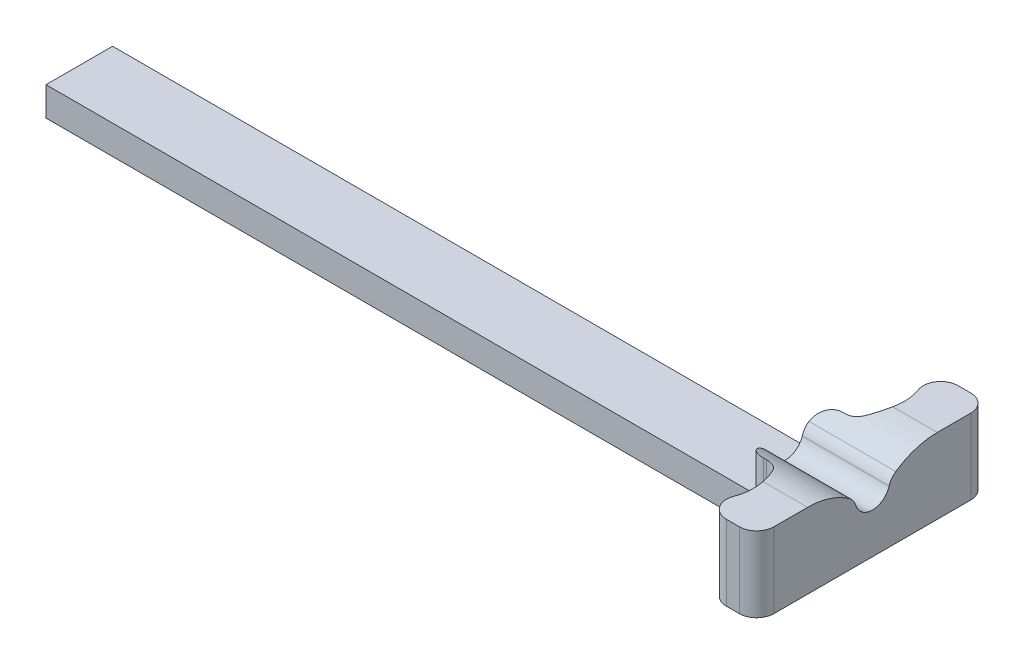
ISO-10303-21;
HEADER;
FILE_DESCRIPTION(('STEP AP214'),'2;1');
FILE_NAME('part.step','',(''),(''),'','','');
FILE_SCHEMA(('AUTOMOTIVE_DESIGN { 1 0 10303 214 1 1 1 1 }'));
ENDSEC;
DATA;
#1=APPLICATION_CONTEXT('core data for automotive mechanical design processes');
#2=APPLICATION_PROTOCOL_DEFINITION('international standard','automotive_design',2000,#1);
#3=PRODUCT_CONTEXT('',#1,'mechanical');
#4=PRODUCT('Part','Part','',(#3));
#5=PRODUCT_RELATED_PRODUCT_CATEGORY('part','',(#4));
#6=PRODUCT_DEFINITION_FORMATION('','',#4);
#7=PRODUCT_DEFINITION_CONTEXT('part definition',#1,'design');
#8=PRODUCT_DEFINITION('design','',#6,#7);
#9=PRODUCT_DEFINITION_SHAPE('','',#8);
#10=(LENGTH_UNIT() NAMED_UNIT(*) SI_UNIT(.MILLI.,.METRE.));
#11=(NAMED_UNIT(*) PLANE_ANGLE_UNIT() SI_UNIT($,.RADIAN.));
#12=(NAMED_UNIT(*) SI_UNIT($,.STERADIAN.) SOLID_ANGLE_UNIT());
#13=UNCERTAINTY_MEASURE_WITH_UNIT(LENGTH_MEASURE(1.E-05),#10,'distance_accuracy_value','');
#14=(GEOMETRIC_REPRESENTATION_CONTEXT(3) GLOBAL_UNCERTAINTY_ASSIGNED_CONTEXT((#13)) GLOBAL_UNIT_ASSIGNED_CONTEXT((#10,
#11,#12)) REPRESENTATION_CONTEXT('',''));
#15=CARTESIAN_POINT('',(0.,0.,0.));
#16=DIRECTION('',(0.,0.,1.));
#17=DIRECTION('',(1.,0.,0.));
#18=AXIS2_PLACEMENT_3D('',#15,#16,#17);
#19=CARTESIAN_POINT('',(0.,13.,0.));
#20=DIRECTION('',(0.,1.,0.));
#21=DIRECTION('',(0.,0.,1.));
#22=AXIS2_PLACEMENT_3D('',#19,#20,#21);
#23=PLANE('',#22);
#24=DIRECTION('',(0.,0.,-1.));
#25=VECTOR('',#24,1.);
#26=CARTESIAN_POINT('',(137.,13.,0.));
#27=LINE('',#26,#25);
#28=CARTESIAN_POINT('',(137.,13.,17.));
#29=VERTEX_POINT('',#28);
#30=CARTESIAN_POINT('',(137.,13.,11.1930560673123));
#31=VERTEX_POINT('',#30);
#32=EDGE_CURVE('E365',#29,#31,#27,.T.);
#33=ORIENTED_EDGE('',*,*,#32,.T.);
#34=DIRECTION('',(1.,0.,0.));
#35=VECTOR('',#34,1.);
#36=CARTESIAN_POINT('',(0.,13.,11.1930560673123));
#37=LINE('',#36,#35);
#38=CARTESIAN_POINT('',(129.305718128141,13.,11.1930560673123));
#39=VERTEX_POINT('',#38);
#40=EDGE_CURVE('E358',#31,#39,#37,.F.);
#41=ORIENTED_EDGE('',*,*,#40,.T.);
#42=CARTESIAN_POINT('',(121.,13.,13.));
#43=DIRECTION('',(0.,1.,0.));
#44=DIRECTION('',(0.,0.,1.));
#45=AXIS2_PLACEMENT_3D('',#42,#43,#44);
#46=CIRCLE('',#45,8.50000000000001);
#47=CARTESIAN_POINT('',(128.969252110835,13.,15.9565217391304));
#48=VERTEX_POINT('',#47);
#49=EDGE_CURVE('E388',#48,#39,#46,.T.);
#50=ORIENTED_EDGE('',*,*,#49,.F.);
#51=CARTESIAN_POINT('',(131.781929326424,13.,17.));
#52=DIRECTION('',(0.,1.,0.));
#53=DIRECTION('',(0.,0.,1.));
#54=AXIS2_PLACEMENT_3D('',#51,#52,#53);
#55=CIRCLE('',#54,2.99999999999999);
#56=CARTESIAN_POINT('',(131.781929326424,13.,20.));
#57=VERTEX_POINT('',#56);
#58=EDGE_CURVE('E392',#57,#48,#55,.F.);
#59=ORIENTED_EDGE('',*,*,#58,.F.);
#60=DIRECTION('',(-1.,0.,0.));
#61=VECTOR('',#60,1.);
#62=CARTESIAN_POINT('',(0.,13.,20.));
#63=LINE('',#62,#61);
#64=CARTESIAN_POINT('',(134.,13.,20.));
#65=VERTEX_POINT('',#64);
#66=EDGE_CURVE('E396',#65,#57,#63,.T.);
#67=ORIENTED_EDGE('',*,*,#66,.F.);
#68=CARTESIAN_POINT('',(134.,13.,17.));
#69=DIRECTION('',(0.,1.,0.));
#70=DIRECTION('',(0.,0.,1.));
#71=AXIS2_PLACEMENT_3D('',#68,#69,#70);
#72=CIRCLE('',#71,3.);
#73=EDGE_CURVE('E400',#29,#65,#72,.F.);
#74=ORIENTED_EDGE('',*,*,#73,.F.);
#75=EDGE_LOOP('',(#33,#41,#50,#59,#67,#74));
#76=FACE_BOUND('',#75,.T.);
#77=ADVANCED_FACE('F39',(#76),#23,.T.);
#78=CARTESIAN_POINT('',(125.,13.,3.83772233983162));
#79=DIRECTION('',(0.,-1.,0.));
#80=DIRECTION('',(0.,0.,-1.));
#81=AXIS2_PLACEMENT_3D('',#78,#79,#80);
#82=CYLINDRICAL_SURFACE('',#81,3.);
#83=CARTESIAN_POINT('',(122.,10.5976213702749,3.83772233983162));
#84=CARTESIAN_POINT('',(121.999968054966,10.6234827525799,3.8689860317511));
#85=CARTESIAN_POINT('',(122.000472213307,10.6486825345902,3.90073603185146));
#86=CARTESIAN_POINT('',(122.002552736736,10.6977588979601,3.96520864833329));
#87=CARTESIAN_POINT('',(122.004129101822,10.7216354793229,3.99793126471233));
#88=CARTESIAN_POINT('',(122.00624157028,10.7448504603944,4.03114018926981));
#89=B_SPLINE_CURVE_WITH_KNOTS('',3,(#83,#84,#85,#86,#87,#88),.UNSPECIFIED.,.F.,.F.,(4,2,4),(0.,
0.121614601337001,0.243229202369703),.UNSPECIFIED.);
#90=CARTESIAN_POINT('',(122.,10.5976213702749,3.83772233983162));
#91=VERTEX_POINT('',#90);
#92=CARTESIAN_POINT('',(122.00624157028,10.7448504603944,4.03114018926981));
#93=VERTEX_POINT('',#92);
#94=EDGE_CURVE('E547',#91,#93,#89,.T.);
#95=ORIENTED_EDGE('',*,*,#94,.F.);
#96=DIRECTION('',(0.,-1.,0.));
#97=VECTOR('',#96,1.);
#98=CARTESIAN_POINT('',(122.,13.,3.83772233983162));
#99=LINE('',#98,#97);
#100=CARTESIAN_POINT('',(122.,5.,3.83772233983162));
#101=VERTEX_POINT('',#100);
#102=EDGE_CURVE('E475',#91,#101,#99,.T.);
#103=ORIENTED_EDGE('',*,*,#102,.T.);
#104=CARTESIAN_POINT('',(125.,5.,3.83772233983162));
#105=DIRECTION('',(0.,1.,0.));
#106=DIRECTION('',(0.,0.,1.));
#107=AXIS2_PLACEMENT_3D('',#104,#105,#106);
#108=CIRCLE('',#107,3.);
#109=CARTESIAN_POINT('',(122.688464979625,5.,5.75));
#110=VERTEX_POINT('',#109);
#111=EDGE_CURVE('E531',#110,#101,#108,.F.);
#112=ORIENTED_EDGE('',*,*,#111,.F.);
#113=DIRECTION('',(0.,-1.,0.));
#114=VECTOR('',#113,1.);
#115=CARTESIAN_POINT('',(122.688464979625,5.,5.75));
#116=LINE('',#115,#114);
#117=CARTESIAN_POINT('',(122.688464979625,0.,5.75000000000001));
#118=VERTEX_POINT('',#117);
#119=EDGE_CURVE('E559',#110,#118,#116,.T.);
#120=ORIENTED_EDGE('',*,*,#119,.T.);
#121=CARTESIAN_POINT('',(125.,0.,3.83772233983162));
#122=DIRECTION('',(0.,1.,0.));
#123=DIRECTION('',(0.,0.,1.));
#124=AXIS2_PLACEMENT_3D('',#121,#122,#123);
#125=CIRCLE('',#124,3.);
#126=CARTESIAN_POINT('',(125.,0.,6.83772233983162));
#127=VERTEX_POINT('',#126);
#128=EDGE_CURVE('E432',#127,#118,#125,.F.);
#129=ORIENTED_EDGE('',*,*,#128,.F.);
#130=DIRECTION('',(0.,-1.,0.));
#131=VECTOR('',#130,1.);
#132=CARTESIAN_POINT('',(125.,13.,6.83772233983162));
#133=LINE('',#132,#131);
#134=CARTESIAN_POINT('',(125.,12.2167003939792,6.83772233983206));
#135=VERTEX_POINT('',#134);
#136=EDGE_CURVE('E472',#135,#127,#133,.T.);
#137=ORIENTED_EDGE('',*,*,#136,.F.);
#138=CARTESIAN_POINT('',(122.00624157028,10.7448504603944,4.03114018926981));
#139=CARTESIAN_POINT('',(122.011683224273,10.8037886665638,4.1154292315416));
#140=CARTESIAN_POINT('',(122.020747629084,10.8615767402885,4.20032770337253));
#141=CARTESIAN_POINT('',(122.046480150296,10.9745859609346,4.37078085667669));
#142=CARTESIAN_POINT('',(122.063154866377,11.0298048339435,4.45633604421043));
#143=CARTESIAN_POINT('',(122.104593269238,11.1376576030521,4.62795160478762));
#144=CARTESIAN_POINT('',(122.129409232869,11.1902721945398,4.71401161552303));
#145=CARTESIAN_POINT('',(122.187377793629,11.2921992201055,4.88525485948984));
#146=CARTESIAN_POINT('',(122.22052819788,11.341512518473,4.97043831722427));
#147=CARTESIAN_POINT('',(122.295586681666,11.4368435294916,5.13955031744102));
#148=CARTESIAN_POINT('',(122.337545566925,11.4828399473877,5.223468412396));
#149=CARTESIAN_POINT('',(122.430165173816,11.5709454260439,5.38849616479621));
#150=CARTESIAN_POINT('',(122.480824843712,11.6130549556996,5.46960616025737));
#151=CARTESIAN_POINT('',(122.59058658264,11.6930531719204,5.62768228623201));
#152=CARTESIAN_POINT('',(122.649661747589,11.7309546495313,5.70466058538662));
#153=CARTESIAN_POINT('',(122.776098836185,11.8025279558044,5.85360958158748));
#154=CARTESIAN_POINT('',(122.843459134853,11.8362006112634,5.92558125627068));
#155=CARTESIAN_POINT('',(122.976377595301,11.8949718993303,6.05409540564281));
#156=CARTESIAN_POINT('',(123.040952068208,11.9206143618037,6.11140930071642));
#157=CARTESIAN_POINT('',(123.175544289344,11.9686466140733,6.22076171707703));
#158=CARTESIAN_POINT('',(123.245561373366,11.9910367998184,6.27280088030357));
#159=CARTESIAN_POINT('',(123.390588611428,12.032587435125,6.37099494252104));
#160=CARTESIAN_POINT('',(123.465602384595,12.0517455073768,6.4171455042541));
#161=CARTESIAN_POINT('',(123.619979443979,12.0868407979365,6.50293135720967));
#162=CARTESIAN_POINT('',(123.699342330013,12.1027783119531,6.54256724654131));
#163=CARTESIAN_POINT('',(123.854605864197,12.1302161413268,6.61164473846825));
#164=CARTESIAN_POINT('',(123.930197768431,12.141983328657,6.64167614018236));
#165=CARTESIAN_POINT('',(124.083891685187,12.1629149883213,6.6955844409398));
#166=CARTESIAN_POINT('',(124.161993490835,12.1720796745517,6.71946184575743));
#167=CARTESIAN_POINT('',(124.319983989318,12.1878299682168,6.76077461705021));
#168=CARTESIAN_POINT('',(124.39986925002,12.1944201423278,6.77822138706634));
#169=CARTESIAN_POINT('',(124.560928533936,12.2050729475905,6.80654294537395));
#170=CARTESIAN_POINT('',(124.642101842544,12.2091369332204,6.81742125541715));
#171=CARTESIAN_POINT('',(124.769563027627,12.213535482083,6.82921539070689));
#172=CARTESIAN_POINT('',(124.81562360119,12.2147235601997,6.83240702371563));
#173=CARTESIAN_POINT('',(124.907787593178,12.216305221734,6.83665915189104));
#174=CARTESIAN_POINT('',(124.953890844646,12.2166999900733,6.83772282545955));
#175=CARTESIAN_POINT('',(125.,12.2167003939791,6.83772233983162));
#176=B_SPLINE_CURVE_WITH_KNOTS('',3,(#138,#139,#140,#141,#142,#143,#144,#145,#146,#147,#148,
#149,#150,#151,#152,#153,#154,#155,#156,#157,#158,#159,#160,#161,#162,#163,#164,#165,#166,#167,
#168,#169,#170,#171,#172,#173,#174,#175),.UNSPECIFIED.,.F.,.F.,(4,2,2,2,2,2,2,2,2,2,2,2,2,2,2,2,
2,2,4),(0.,0.308961290265499,0.618191023159303,0.92944658331579,1.24062033445256,
1.55364077601952,1.86662340682019,2.17862700704322,2.49056951071628,2.76041242153253,
3.03022245269705,3.30023007952983,3.57021290322062,3.81646721150254,4.06270127459318,
4.3084965620667,4.55415994641444,4.69266874184475,4.83097050030373),.UNSPECIFIED.);
#177=EDGE_CURVE('E621',#93,#135,#176,.T.);
#178=ORIENTED_EDGE('',*,*,#177,.F.);
#179=EDGE_LOOP('',(#95,#103,#112,#120,#129,#137,#178));
#180=FACE_BOUND('',#179,.T.);
#181=ADVANCED_FACE('F323',(#180),#82,.T.);
#182=CARTESIAN_POINT('',(137.,13.,0.));
#183=DIRECTION('',(-1.,0.,0.));
#184=DIRECTION('',(0.,0.,1.));
#185=AXIS2_PLACEMENT_3D('',#182,#183,#184);
#186=PLANE('',#185);
#187=CARTESIAN_POINT('',(137.,8.28608634989974,5.75));
#188=DIRECTION('',(-1.,0.,0.));
#189=DIRECTION('',(0.,0.,-1.));
#190=AXIS2_PLACEMENT_3D('',#187,#188,#189);
#191=CIRCLE('',#190,3.);
#192=CARTESIAN_POINT('',(137.,10.7448504603944,4.03114018926981));
#193=VERTEX_POINT('',#192);
#194=CARTESIAN_POINT('',(137.,9.14304317494987,2.875));
#195=VERTEX_POINT('',#194);
#196=EDGE_CURVE('E229',#193,#195,#191,.T.);
#197=ORIENTED_EDGE('',*,*,#196,.F.);
#198=CARTESIAN_POINT('',(137.,0.500000000000001,11.1930560673123));
#199=DIRECTION('',(-1.,0.,0.));
#200=DIRECTION('',(0.,0.,-1.));
#201=AXIS2_PLACEMENT_3D('',#198,#199,#200);
#202=CIRCLE('',#201,12.5);
#203=EDGE_CURVE('E226',#31,#193,#202,.T.);
#204=ORIENTED_EDGE('',*,*,#203,.F.);
#205=ORIENTED_EDGE('',*,*,#32,.F.);
#206=DIRECTION('',(0.,-1.,0.));
#207=VECTOR('',#206,1.);
#208=CARTESIAN_POINT('',(137.,13.,17.));
#209=LINE('',#208,#207);
#210=CARTESIAN_POINT('',(137.,0.,17.));
#211=VERTEX_POINT('',#210);
#212=EDGE_CURVE('E404',#29,#211,#209,.T.);
#213=ORIENTED_EDGE('',*,*,#212,.T.);
#214=DIRECTION('',(0.,0.,-1.));
#215=VECTOR('',#214,1.);
#216=CARTESIAN_POINT('',(137.,0.,0.));
#217=LINE('',#216,#215);
#218=CARTESIAN_POINT('',(137.,0.,-17.));
#219=VERTEX_POINT('',#218);
#220=EDGE_CURVE('E405',#211,#219,#217,.T.);
#221=ORIENTED_EDGE('',*,*,#220,.T.);
#222=DIRECTION('',(0.,-1.,0.));
#223=VECTOR('',#222,1.);
#224=CARTESIAN_POINT('',(137.,13.,-17.));
#225=LINE('',#224,#223);
#226=CARTESIAN_POINT('',(137.,13.,-17.));
#227=VERTEX_POINT('',#226);
#228=EDGE_CURVE('E359',#227,#219,#225,.T.);
#229=ORIENTED_EDGE('',*,*,#228,.F.);
#230=CARTESIAN_POINT('',(137.,13.,-11.1930560673123));
#231=VERTEX_POINT('',#230);
#232=EDGE_CURVE('E352',#231,#227,#27,.T.);
#233=ORIENTED_EDGE('',*,*,#232,.F.);
#234=CARTESIAN_POINT('',(137.,0.500000000000001,-11.1930560673123));
#235=DIRECTION('',(-1.,0.,0.));
#236=DIRECTION('',(0.,0.,1.));
#237=AXIS2_PLACEMENT_3D('',#234,#235,#236);
#238=CIRCLE('',#237,12.5);
#239=CARTESIAN_POINT('',(137.,10.7448504603944,-4.03114018926981));
#240=VERTEX_POINT('',#239);
#241=EDGE_CURVE('E55',#240,#231,#238,.T.);
#242=ORIENTED_EDGE('',*,*,#241,.F.);
#243=CARTESIAN_POINT('',(137.,8.28608634989973,-5.75));
#244=DIRECTION('',(-1.,0.,0.));
#245=DIRECTION('',(0.,0.,1.));
#246=AXIS2_PLACEMENT_3D('',#243,#244,#245);
#247=CIRCLE('',#246,3.);
#248=CARTESIAN_POINT('',(137.,9.14304317494986,-2.875));
#249=VERTEX_POINT('',#248);
#250=EDGE_CURVE('E239',#249,#240,#247,.T.);
#251=ORIENTED_EDGE('',*,*,#250,.F.);
#252=CARTESIAN_POINT('',(137.,10.,0.));
#253=DIRECTION('',(1.,0.,0.));
#254=DIRECTION('',(0.,0.,-1.));
#255=AXIS2_PLACEMENT_3D('',#252,#253,#254);
#256=CIRCLE('',#255,3.);
#257=EDGE_CURVE('E219',#195,#249,#256,.T.);
#258=ORIENTED_EDGE('',*,*,#257,.F.);
#259=EDGE_LOOP('',(#197,#204,#205,#213,#221,#229,#233,#242,#251,#258));
#260=FACE_BOUND('',#259,.T.);
#261=ADVANCED_FACE('F41',(#260),#186,.F.);
#262=CARTESIAN_POINT('',(134.,13.,-17.));
#263=DIRECTION('',(0.,-1.,0.));
#264=DIRECTION('',(0.,0.,-1.));
#265=AXIS2_PLACEMENT_3D('',#262,#263,#264);
#266=CYLINDRICAL_SURFACE('',#265,3.);
#267=CARTESIAN_POINT('',(134.,0.,-17.));
#268=DIRECTION('',(0.,1.,0.));
#269=DIRECTION('',(0.,0.,1.));
#270=AXIS2_PLACEMENT_3D('',#267,#268,#269);
#271=CIRCLE('',#270,3.);
#272=CARTESIAN_POINT('',(134.,0.,-20.));
#273=VERTEX_POINT('',#272);
#274=EDGE_CURVE('E408',#219,#273,#271,.T.);
#275=ORIENTED_EDGE('',*,*,#274,.T.);
#276=DIRECTION('',(0.,-1.,0.));
#277=VECTOR('',#276,1.);
#278=CARTESIAN_POINT('',(134.,13.,-20.));
#279=LINE('',#278,#277);
#280=CARTESIAN_POINT('',(134.,13.,-20.));
#281=VERTEX_POINT('',#280);
#282=EDGE_CURVE('E498',#281,#273,#279,.T.);
#283=ORIENTED_EDGE('',*,*,#282,.F.);
#284=CARTESIAN_POINT('',(134.,13.,-17.));
#285=DIRECTION('',(0.,1.,0.));
#286=DIRECTION('',(0.,0.,1.));
#287=AXIS2_PLACEMENT_3D('',#284,#285,#286);
#288=CIRCLE('',#287,3.);
#289=EDGE_CURVE('E370',#227,#281,#288,.T.);
#290=ORIENTED_EDGE('',*,*,#289,.F.);
#291=ORIENTED_EDGE('',*,*,#228,.T.);
#292=EDGE_LOOP('',(#275,#283,#290,#291));
#293=FACE_BOUND('',#292,.T.);
#294=ADVANCED_FACE('F316',(#293),#266,.T.);
#295=CARTESIAN_POINT('',(0.,13.,-20.));
#296=DIRECTION('',(0.,0.,1.));
#297=DIRECTION('',(1.,0.,0.));
#298=AXIS2_PLACEMENT_3D('',#295,#296,#297);
#299=PLANE('',#298);
#300=DIRECTION('',(-1.,0.,0.));
#301=VECTOR('',#300,1.);
#302=CARTESIAN_POINT('',(0.,0.,-20.));
#303=LINE('',#302,#301);
#304=CARTESIAN_POINT('',(131.781929326424,0.,-20.));
#305=VERTEX_POINT('',#304);
#306=EDGE_CURVE('E411',#273,#305,#303,.T.);
#307=ORIENTED_EDGE('',*,*,#306,.T.);
#308=DIRECTION('',(0.,-1.,0.));
#309=VECTOR('',#308,1.);
#310=CARTESIAN_POINT('',(131.781929326424,13.,-20.));
#311=LINE('',#310,#309);
#312=CARTESIAN_POINT('',(131.781929326424,13.,-20.));
#313=VERTEX_POINT('',#312);
#314=EDGE_CURVE('E494',#313,#305,#311,.T.);
#315=ORIENTED_EDGE('',*,*,#314,.F.);
#316=DIRECTION('',(-1.,0.,0.));
#317=VECTOR('',#316,1.);
#318=CARTESIAN_POINT('',(0.,13.,-20.));
#319=LINE('',#318,#317);
#320=EDGE_CURVE('E380',#281,#313,#319,.T.);
#321=ORIENTED_EDGE('',*,*,#320,.F.);
#322=ORIENTED_EDGE('',*,*,#282,.T.);
#323=EDGE_LOOP('',(#307,#315,#321,#322));
#324=FACE_BOUND('',#323,.T.);
#325=ADVANCED_FACE('F313',(#324),#299,.F.);
#326=CARTESIAN_POINT('',(131.781929326424,13.,-17.));
#327=DIRECTION('',(0.,-1.,0.));
#328=DIRECTION('',(0.,0.,-1.));
#329=AXIS2_PLACEMENT_3D('',#326,#327,#328);
#330=CYLINDRICAL_SURFACE('',#329,2.99999999999999);
#331=CARTESIAN_POINT('',(131.781929326424,0.,-17.));
#332=DIRECTION('',(0.,1.,0.));
#333=DIRECTION('',(0.,0.,1.));
#334=AXIS2_PLACEMENT_3D('',#331,#332,#333);
#335=CIRCLE('',#334,2.99999999999999);
#336=CARTESIAN_POINT('',(128.969252110835,0.,-15.9565217391304));
#337=VERTEX_POINT('',#336);
#338=EDGE_CURVE('E414',#305,#337,#335,.T.);
#339=ORIENTED_EDGE('',*,*,#338,.T.);
#340=DIRECTION('',(0.,-1.,0.));
#341=VECTOR('',#340,1.);
#342=CARTESIAN_POINT('',(128.969252110835,13.,-15.9565217391304));
#343=LINE('',#342,#341);
#344=CARTESIAN_POINT('',(128.969252110835,13.,-15.9565217391304));
#345=VERTEX_POINT('',#344);
#346=EDGE_CURVE('E490',#345,#337,#343,.T.);
#347=ORIENTED_EDGE('',*,*,#346,.F.);
#348=CARTESIAN_POINT('',(131.781929326424,13.,-17.));
#349=DIRECTION('',(0.,1.,0.));
#350=DIRECTION('',(0.,0.,1.));
#351=AXIS2_PLACEMENT_3D('',#348,#349,#350);
#352=CIRCLE('',#351,2.99999999999999);
#353=EDGE_CURVE('E383',#313,#345,#352,.T.);
#354=ORIENTED_EDGE('',*,*,#353,.F.);
#355=ORIENTED_EDGE('',*,*,#314,.T.);
#356=EDGE_LOOP('',(#339,#347,#354,#355));
#357=FACE_BOUND('',#356,.T.);
#358=ADVANCED_FACE('F309',(#357),#330,.T.);
#359=CARTESIAN_POINT('',(121.,13.,-13.));
#360=DIRECTION('',(0.,-1.,0.));
#361=DIRECTION('',(0.,0.,-1.));
#362=AXIS2_PLACEMENT_3D('',#359,#360,#361);
#363=CYLINDRICAL_SURFACE('',#362,8.50000000000001);
#364=DIRECTION('',(0.,-1.,0.));
#365=VECTOR('',#364,1.);
#366=CARTESIAN_POINT('',(127.954545454545,13.,-8.11284361610342));
#367=LINE('',#366,#365);
#368=CARTESIAN_POINT('',(127.954545454545,12.6145487433671,-8.11284361610342));
#369=VERTEX_POINT('',#368);
#370=CARTESIAN_POINT('',(127.954545454545,0.,-8.11284361610342));
#371=VERTEX_POINT('',#370);
#372=EDGE_CURVE('E487',#369,#371,#367,.T.);
#373=ORIENTED_EDGE('',*,*,#372,.F.);
#374=CARTESIAN_POINT('',(127.954545454545,12.6145487433671,-8.11284361610342));
#375=CARTESIAN_POINT('',(128.07682719117,12.6588060565174,-8.28682083730113));
#376=CARTESIAN_POINT('',(128.192910010819,12.7003318801259,-8.46592128489257));
#377=CARTESIAN_POINT('',(128.411950583327,12.7767340944168,-8.83361626203554));
#378=CARTESIAN_POINT('',(128.514892688323,12.811602581628,-9.02222174430993));
#379=CARTESIAN_POINT('',(128.704801199055,12.8728034097642,-9.40407809271414));
#380=CARTESIAN_POINT('',(128.792035144303,12.8992860455668,-9.5971714682021));
#381=CARTESIAN_POINT('',(128.952058762872,12.9435460744033,-9.99006726137924));
#382=CARTESIAN_POINT('',(129.024860477776,12.9613307429518,-10.1898639220082));
#383=CARTESIAN_POINT('',(129.132364957679,12.982739895194,-10.5233890387032));
#384=CARTESIAN_POINT('',(129.171445740475,12.989146693264,-10.655547831359));
#385=CARTESIAN_POINT('',(129.2433928498,12.997792700349,-10.9225662553988));
#386=CARTESIAN_POINT('',(129.276218842321,13.0000056325397,-11.0574375994147));
#387=CARTESIAN_POINT('',(129.305718128141,13.,-11.1930560673123));
#388=B_SPLINE_CURVE_WITH_KNOTS('',3,(#374,#375,#376,#377,#378,#379,#380,#381,#382,#383,#384,
#385,#386,#387),.UNSPECIFIED.,.F.,.F.,(4,2,2,2,2,2,4),(0.,0.651550214644083,1.30386919286653,
1.94373115526315,2.58305697846342,2.99674105504962,3.41300862427327),.UNSPECIFIED.);
#389=CARTESIAN_POINT('',(129.305718128141,13.,-11.1930560673123));
#390=VERTEX_POINT('',#389);
#391=EDGE_CURVE('E293',#369,#390,#388,.T.);
#392=ORIENTED_EDGE('',*,*,#391,.T.);
#393=CARTESIAN_POINT('',(121.,13.,-13.));
#394=DIRECTION('',(0.,1.,0.));
#395=DIRECTION('',(0.,0.,1.));
#396=AXIS2_PLACEMENT_3D('',#393,#394,#395);
#397=CIRCLE('',#396,8.50000000000001);
#398=EDGE_CURVE('E355',#345,#390,#397,.F.);
#399=ORIENTED_EDGE('',*,*,#398,.F.);
#400=ORIENTED_EDGE('',*,*,#346,.T.);
#401=CARTESIAN_POINT('',(121.,0.,-13.));
#402=DIRECTION('',(0.,1.,0.));
#403=DIRECTION('',(0.,0.,1.));
#404=AXIS2_PLACEMENT_3D('',#401,#402,#403);
#405=CIRCLE('',#404,8.50000000000001);
#406=EDGE_CURVE('E417',#337,#371,#405,.F.);
#407=ORIENTED_EDGE('',*,*,#406,.T.);
#408=EDGE_LOOP('',(#373,#392,#399,#400,#407));
#409=FACE_BOUND('',#408,.T.);
#410=ADVANCED_FACE('F304',(#409),#363,.F.);
#411=CARTESIAN_POINT('',(125.5,13.,-9.83772233983162));
#412=DIRECTION('',(0.,-1.,0.));
#413=DIRECTION('',(0.,0.,-1.));
#414=AXIS2_PLACEMENT_3D('',#411,#412,#413);
#415=CYLINDRICAL_SURFACE('',#414,3.00000000000002);
#416=DIRECTION('',(0.,-1.,0.));
#417=VECTOR('',#416,1.);
#418=CARTESIAN_POINT('',(125.5,13.,-6.83772233983162));
#419=LINE('',#418,#417);
#420=CARTESIAN_POINT('',(125.5,12.2167003939792,-6.83772233983206));
#421=VERTEX_POINT('',#420);
#422=CARTESIAN_POINT('',(125.5,0.,-6.83772233983162));
#423=VERTEX_POINT('',#422);
#424=EDGE_CURVE('E484',#421,#423,#419,.T.);
#425=ORIENTED_EDGE('',*,*,#424,.F.);
#426=CARTESIAN_POINT('',(125.5,12.2167003939791,-6.8377223398316));
#427=CARTESIAN_POINT('',(125.581354574937,12.2166897050821,-6.83771138671846));
#428=CARTESIAN_POINT('',(125.662702198404,12.2179302737686,-6.84103139397672));
#429=CARTESIAN_POINT('',(125.824767653046,12.2228340408172,-6.85424830860972));
#430=CARTESIAN_POINT('',(125.905485639995,12.2264966194023,-6.86414353343082));
#431=CARTESIAN_POINT('',(126.065389310837,12.2361447546272,-6.89037200240274));
#432=CARTESIAN_POINT('',(126.144579924361,12.242120714514,-6.90667865392846));
#433=CARTESIAN_POINT('',(126.301189219246,12.2562402809121,-6.94555801090962));
#434=CARTESIAN_POINT('',(126.378607850844,12.2643839482181,-6.9681308921058));
#435=CARTESIAN_POINT('',(126.607359062496,12.2917865380471,-7.04495284131534));
#436=CARTESIAN_POINT('',(126.755384396437,12.3140296482297,-7.10833802014263));
#437=CARTESIAN_POINT('',(127.038713317232,12.3645165190002,-7.25739685856211));
#438=CARTESIAN_POINT('',(127.174000012931,12.392768089413,-7.34309955942968));
#439=CARTESIAN_POINT('',(127.427433643259,12.452693240668,-7.53342031580704));
#440=CARTESIAN_POINT('',(127.545747727798,12.4843271851489,-7.63782726616193));
#441=CARTESIAN_POINT('',(127.709597894904,12.5327900491511,-7.80699481882789));
#442=CARTESIAN_POINT('',(127.761934376779,12.5491092701244,-7.86546252432931));
#443=CARTESIAN_POINT('',(127.861856764981,12.5818305716791,-7.98629865923453));
#444=CARTESIAN_POINT('',(127.909442916009,12.5982326479467,-8.04866688744387));
#445=CARTESIAN_POINT('',(127.954545454545,12.6145487433671,-8.11284361610342));
#446=B_SPLINE_CURVE_WITH_KNOTS('',3,(#426,#427,#428,#429,#430,#431,#432,#433,#434,#435,#436,
#437,#438,#439,#440,#441,#442,#443,#444,#445),.UNSPECIFIED.,.F.,.F.,(4,2,2,2,2,2,2,2,2,4),(0.,
0.243974790375944,0.487887173285595,0.730798377760289,0.973716395535747,1.45895836885047,
1.94483495939568,2.425538463228,2.66578386061621,2.9060168760113),.UNSPECIFIED.);
#447=EDGE_CURVE('E285',#421,#369,#446,.T.);
#448=ORIENTED_EDGE('',*,*,#447,.T.);
#449=ORIENTED_EDGE('',*,*,#372,.T.);
#450=CARTESIAN_POINT('',(125.5,0.,-9.83772233983162));
#451=DIRECTION('',(0.,1.,0.));
#452=DIRECTION('',(0.,0.,1.));
#453=AXIS2_PLACEMENT_3D('',#450,#451,#452);
#454=CIRCLE('',#453,3.00000000000002);
#455=EDGE_CURVE('E421',#371,#423,#454,.F.);
#456=ORIENTED_EDGE('',*,*,#455,.T.);
#457=EDGE_LOOP('',(#425,#448,#449,#456));
#458=FACE_BOUND('',#457,.T.);
#459=ADVANCED_FACE('F300',(#458),#415,.F.);
#460=CARTESIAN_POINT('',(0.,13.,-6.83772233983205));
#461=DIRECTION('',(0.,0.,1.));
#462=DIRECTION('',(1.,0.,0.));
#463=AXIS2_PLACEMENT_3D('',#460,#461,#462);
#464=PLANE('',#463);
#465=DIRECTION('',(0.,-1.,0.));
#466=VECTOR('',#465,1.);
#467=CARTESIAN_POINT('',(125.,13.,-6.83772233983162));
#468=LINE('',#467,#466);
#469=CARTESIAN_POINT('',(125.,12.2167003939791,-6.83772233983162));
#470=VERTEX_POINT('',#469);
#471=CARTESIAN_POINT('',(125.,0.,-6.83772233983162));
#472=VERTEX_POINT('',#471);
#473=EDGE_CURVE('E481',#470,#472,#468,.T.);
#474=ORIENTED_EDGE('',*,*,#473,.F.);
#475=DIRECTION('',(1.,0.,0.));
#476=VECTOR('',#475,1.);
#477=CARTESIAN_POINT('',(0.,12.2167003939792,-6.83772233983206));
#478=LINE('',#477,#476);
#479=EDGE_CURVE('E266',#470,#421,#478,.T.);
#480=ORIENTED_EDGE('',*,*,#479,.T.);
#481=ORIENTED_EDGE('',*,*,#424,.T.);
#482=DIRECTION('',(-1.,0.,0.));
#483=VECTOR('',#482,1.);
#484=CARTESIAN_POINT('',(0.,0.,-6.83772233983205));
#485=LINE('',#484,#483);
#486=EDGE_CURVE('E425',#423,#472,#485,.T.);
#487=ORIENTED_EDGE('',*,*,#486,.T.);
#488=EDGE_LOOP('',(#474,#480,#481,#487));
#489=FACE_BOUND('',#488,.T.);
#490=ADVANCED_FACE('F303',(#489),#464,.F.);
#491=CARTESIAN_POINT('',(125.,13.,-3.83772233983162));
#492=DIRECTION('',(0.,-1.,0.));
#493=DIRECTION('',(0.,0.,-1.));
#494=AXIS2_PLACEMENT_3D('',#491,#492,#493);
#495=CYLINDRICAL_SURFACE('',#494,3.);
#496=CARTESIAN_POINT('',(122.,10.5976213702749,-3.83772233983162));
#497=CARTESIAN_POINT('',(121.999968054966,10.6234827525799,-3.8689860317511));
#498=CARTESIAN_POINT('',(122.000472213307,10.6486825345902,-3.90073603185146));
#499=CARTESIAN_POINT('',(122.002552736736,10.6977588979601,-3.96520864833329));
#500=CARTESIAN_POINT('',(122.004129101822,10.7216354793229,-3.99793126471233));
#501=CARTESIAN_POINT('',(122.00624157028,10.7448504603944,-4.03114018926981));
#502=B_SPLINE_CURVE_WITH_KNOTS('',3,(#496,#497,#498,#499,#500,#501),.UNSPECIFIED.,.F.,.F.,(4,2,
4),(0.,0.121614601337001,0.243229202369703),.UNSPECIFIED.);
#503=CARTESIAN_POINT('',(122.,10.5976213702749,-3.83772233983162));
#504=VERTEX_POINT('',#503);
#505=CARTESIAN_POINT('',(122.00624157028,10.7448504603944,-4.03114018926981));
#506=VERTEX_POINT('',#505);
#507=EDGE_CURVE('E517',#504,#506,#502,.T.);
#508=ORIENTED_EDGE('',*,*,#507,.T.);
#509=CARTESIAN_POINT('',(122.00624157028,10.7448504603944,-4.03114018926981));
#510=CARTESIAN_POINT('',(122.011683224273,10.8037886665638,-4.1154292315416));
#511=CARTESIAN_POINT('',(122.020747629084,10.8615767402885,-4.20032770337253));
#512=CARTESIAN_POINT('',(122.046480150296,10.9745859609346,-4.37078085667669));
#513=CARTESIAN_POINT('',(122.063154866377,11.0298048339435,-4.45633604421043));
#514=CARTESIAN_POINT('',(122.104593269238,11.1376576030521,-4.62795160478762));
#515=CARTESIAN_POINT('',(122.129409232869,11.1902721945398,-4.71401161552303));
#516=CARTESIAN_POINT('',(122.187377793629,11.2921992201055,-4.88525485948984));
#517=CARTESIAN_POINT('',(122.22052819788,11.341512518473,-4.97043831722427));
#518=CARTESIAN_POINT('',(122.295586681666,11.4368435294916,-5.13955031744102));
#519=CARTESIAN_POINT('',(122.337545566925,11.4828399473877,-5.223468412396));
#520=CARTESIAN_POINT('',(122.430165173816,11.5709454260439,-5.38849616479621));
#521=CARTESIAN_POINT('',(122.480824843712,11.6130549556996,-5.46960616025737));
#522=CARTESIAN_POINT('',(122.59058658264,11.6930531719204,-5.62768228623201));
#523=CARTESIAN_POINT('',(122.649661747589,11.7309546495312,-5.70466058538663));
#524=CARTESIAN_POINT('',(122.776098836185,11.8025279558044,-5.85360958158749));
#525=CARTESIAN_POINT('',(122.843459134853,11.8362006112634,-5.92558125627069));
#526=CARTESIAN_POINT('',(122.976377595301,11.8949718993303,-6.05409540564281));
#527=CARTESIAN_POINT('',(123.040952068208,11.9206143618037,-6.11140930071643));
#528=CARTESIAN_POINT('',(123.175544289344,11.9686466140733,-6.22076171707703));
#529=CARTESIAN_POINT('',(123.245561373366,11.9910367998184,-6.27280088030357));
#530=CARTESIAN_POINT('',(123.390588611428,12.0325874351249,-6.37099494252104));
#531=CARTESIAN_POINT('',(123.465602384595,12.0517455073768,-6.41714550425411));
#532=CARTESIAN_POINT('',(123.619979443979,12.0868407979365,-6.50293135720968));
#533=CARTESIAN_POINT('',(123.699342330013,12.1027783119531,-6.54256724654131));
#534=CARTESIAN_POINT('',(123.854605864197,12.1302161413268,-6.61164473846825));
#535=CARTESIAN_POINT('',(123.930197768431,12.141983328657,-6.64167614018236));
#536=CARTESIAN_POINT('',(124.083891685187,12.1629149883213,-6.6955844409398));
#537=CARTESIAN_POINT('',(124.161993490835,12.1720796745517,-6.71946184575742));
#538=CARTESIAN_POINT('',(124.319983989318,12.1878299682168,-6.76077461705021));
#539=CARTESIAN_POINT('',(124.39986925002,12.1944201423278,-6.77822138706634));
#540=CARTESIAN_POINT('',(124.560928533936,12.2050729475905,-6.80654294537395));
#541=CARTESIAN_POINT('',(124.642101842544,12.2091369332204,-6.81742125541715));
#542=CARTESIAN_POINT('',(124.769563027627,12.213535482083,-6.82921539070689));
#543=CARTESIAN_POINT('',(124.81562360119,12.2147235601997,-6.83240702371563));
#544=CARTESIAN_POINT('',(124.907787593178,12.216305221734,-6.83665915189104));
#545=CARTESIAN_POINT('',(124.953890844646,12.2166999900733,-6.83772282545955));
#546=CARTESIAN_POINT('',(125.,12.2167003939791,-6.83772233983162));
#547=B_SPLINE_CURVE_WITH_KNOTS('',3,(#509,#510,#511,#512,#513,#514,#515,#516,#517,#518,#519,
#520,#521,#522,#523,#524,#525,#526,#527,#528,#529,#530,#531,#532,#533,#534,#535,#536,#537,#538,
#539,#540,#541,#542,#543,#544,#545,#546),.UNSPECIFIED.,.F.,.F.,(4,2,2,2,2,2,2,2,2,2,2,2,2,2,2,2,
2,2,4),(0.,0.308961290265503,0.618191023159306,0.929446583315789,1.24062033445256,
1.55364077601952,1.86662340682019,2.17862700704322,2.49056951071628,2.76041242153254,
3.03022245269705,3.30023007952984,3.57021290322062,3.81646721150253,4.06270127459318,
4.3084965620667,4.55415994641444,4.69266874184475,4.83097050030373),.UNSPECIFIED.);
#548=EDGE_CURVE('E251',#506,#470,#547,.T.);
#549=ORIENTED_EDGE('',*,*,#548,.T.);
#550=ORIENTED_EDGE('',*,*,#473,.T.);
#551=CARTESIAN_POINT('',(125.,0.,-3.83772233983162));
#552=DIRECTION('',(0.,1.,0.));
#553=DIRECTION('',(0.,0.,1.));
#554=AXIS2_PLACEMENT_3D('',#551,#552,#553);
#555=CIRCLE('',#554,3.);
#556=CARTESIAN_POINT('',(122.688464979625,0.,-5.75));
#557=VERTEX_POINT('',#556);
#558=EDGE_CURVE('E429',#472,#557,#555,.T.);
#559=ORIENTED_EDGE('',*,*,#558,.T.);
#560=DIRECTION('',(0.,-1.,0.));
#561=VECTOR('',#560,1.);
#562=CARTESIAN_POINT('',(122.688464979625,5.,-5.75));
#563=LINE('',#562,#561);
#564=CARTESIAN_POINT('',(122.688464979625,5.,-5.75));
#565=VERTEX_POINT('',#564);
#566=EDGE_CURVE('E63',#565,#557,#563,.T.);
#567=ORIENTED_EDGE('',*,*,#566,.F.);
#568=CARTESIAN_POINT('',(125.,5.,-3.83772233983162));
#569=DIRECTION('',(0.,1.,0.));
#570=DIRECTION('',(0.,0.,1.));
#571=AXIS2_PLACEMENT_3D('',#568,#569,#570);
#572=CIRCLE('',#571,3.);
#573=CARTESIAN_POINT('',(122.,5.,-3.83772233983162));
#574=VERTEX_POINT('',#573);
#575=EDGE_CURVE('E518',#565,#574,#572,.T.);
#576=ORIENTED_EDGE('',*,*,#575,.T.);
#577=DIRECTION('',(0.,-1.,0.));
#578=VECTOR('',#577,1.);
#579=CARTESIAN_POINT('',(122.,13.,-3.83772233983162));
#580=LINE('',#579,#578);
#581=EDGE_CURVE('E478',#504,#574,#580,.T.);
#582=ORIENTED_EDGE('',*,*,#581,.F.);
#583=EDGE_LOOP('',(#508,#549,#550,#559,#567,#576,#582));
#584=FACE_BOUND('',#583,.T.);
#585=ADVANCED_FACE('F268',(#584),#495,.T.);
#586=CARTESIAN_POINT('',(122.,13.,0.));
#587=DIRECTION('',(1.,0.,0.));
#588=DIRECTION('',(0.,0.,-1.));
#589=AXIS2_PLACEMENT_3D('',#586,#587,#588);
#590=PLANE('',#589);
#591=ORIENTED_EDGE('',*,*,#102,.F.);
#592=CARTESIAN_POINT('',(122.,8.28608634989974,5.75));
#593=DIRECTION('',(1.,0.,0.));
#594=DIRECTION('',(0.,0.,-1.));
#595=AXIS2_PLACEMENT_3D('',#592,#593,#594);
#596=CIRCLE('',#595,3.);
#597=CARTESIAN_POINT('',(122.,9.14304317494987,2.875));
#598=VERTEX_POINT('',#597);
#599=EDGE_CURVE('E11',#91,#598,#596,.F.);
#600=ORIENTED_EDGE('',*,*,#599,.T.);
#601=CARTESIAN_POINT('',(122.,10.,0.));
#602=DIRECTION('',(1.,0.,0.));
#603=DIRECTION('',(0.,0.,-1.));
#604=AXIS2_PLACEMENT_3D('',#601,#602,#603);
#605=CIRCLE('',#604,3.);
#606=CARTESIAN_POINT('',(122.,9.14304317494986,-2.875));
#607=VERTEX_POINT('',#606);
#608=EDGE_CURVE('E222',#598,#607,#605,.T.);
#609=ORIENTED_EDGE('',*,*,#608,.T.);
#610=CARTESIAN_POINT('',(122.,8.28608634989973,-5.75));
#611=DIRECTION('',(1.,0.,0.));
#612=DIRECTION('',(0.,0.,-1.));
#613=AXIS2_PLACEMENT_3D('',#610,#611,#612);
#614=CIRCLE('',#613,3.);
#615=EDGE_CURVE('E48',#607,#504,#614,.F.);
#616=ORIENTED_EDGE('',*,*,#615,.T.);
#617=ORIENTED_EDGE('',*,*,#581,.T.);
#618=DIRECTION('',(0.,0.,1.));
#619=VECTOR('',#618,1.);
#620=CARTESIAN_POINT('',(122.,5.,0.));
#621=LINE('',#620,#619);
#622=EDGE_CURVE('E525',#574,#101,#621,.T.);
#623=ORIENTED_EDGE('',*,*,#622,.T.);
#624=EDGE_LOOP('',(#591,#600,#609,#616,#617,#623));
#625=FACE_BOUND('',#624,.T.);
#626=ADVANCED_FACE('F513',(#625),#590,.F.);
#627=CARTESIAN_POINT('',(0.,13.,6.83772233983205));
#628=DIRECTION('',(0.,0.,1.));
#629=DIRECTION('',(1.,0.,0.));
#630=AXIS2_PLACEMENT_3D('',#627,#628,#629);
#631=PLANE('',#630);
#632=DIRECTION('',(1.,0.,0.));
#633=VECTOR('',#632,1.);
#634=CARTESIAN_POINT('',(0.,12.2167003939792,6.83772233983206));
#635=LINE('',#634,#633);
#636=CARTESIAN_POINT('',(125.5,12.2167003939791,6.8377223398316));
#637=VERTEX_POINT('',#636);
#638=EDGE_CURVE('E618',#135,#637,#635,.T.);
#639=ORIENTED_EDGE('',*,*,#638,.F.);
#640=ORIENTED_EDGE('',*,*,#136,.T.);
#641=DIRECTION('',(-1.,0.,0.));
#642=VECTOR('',#641,1.);
#643=CARTESIAN_POINT('',(0.,0.,6.83772233983205));
#644=LINE('',#643,#642);
#645=CARTESIAN_POINT('',(125.5,0.,6.83772233983162));
#646=VERTEX_POINT('',#645);
#647=EDGE_CURVE('E436',#646,#127,#644,.T.);
#648=ORIENTED_EDGE('',*,*,#647,.F.);
#649=DIRECTION('',(0.,-1.,0.));
#650=VECTOR('',#649,1.);
#651=CARTESIAN_POINT('',(125.5,13.,6.83772233983162));
#652=LINE('',#651,#650);
#653=EDGE_CURVE('E469',#637,#646,#652,.T.);
#654=ORIENTED_EDGE('',*,*,#653,.F.);
#655=EDGE_LOOP('',(#639,#640,#648,#654));
#656=FACE_BOUND('',#655,.T.);
#657=ADVANCED_FACE('F616',(#656),#631,.T.);
#658=CARTESIAN_POINT('',(125.5,13.,9.83772233983162));
#659=DIRECTION('',(0.,-1.,0.));
#660=DIRECTION('',(0.,0.,-1.));
#661=AXIS2_PLACEMENT_3D('',#658,#659,#660);
#662=CYLINDRICAL_SURFACE('',#661,3.00000000000002);
#663=CARTESIAN_POINT('',(125.5,12.2167003939791,6.8377223398316));
#664=CARTESIAN_POINT('',(125.581354574937,12.2166897050821,6.83771138671846));
#665=CARTESIAN_POINT('',(125.662702198404,12.2179302737686,6.84103139397672));
#666=CARTESIAN_POINT('',(125.824767653046,12.2228340408172,6.85424830860972));
#667=CARTESIAN_POINT('',(125.905485639995,12.2264966194024,6.86414353343082));
#668=CARTESIAN_POINT('',(126.065389310837,12.2361447546273,6.89037200240274));
#669=CARTESIAN_POINT('',(126.144579924361,12.242120714514,6.90667865392846));
#670=CARTESIAN_POINT('',(126.301189219246,12.2562402809121,6.94555801090962));
#671=CARTESIAN_POINT('',(126.378607850844,12.2643839482181,6.9681308921058));
#672=CARTESIAN_POINT('',(126.607359062496,12.2917865380471,7.04495284131534));
#673=CARTESIAN_POINT('',(126.755384396437,12.3140296482297,7.10833802014263));
#674=CARTESIAN_POINT('',(127.038713317232,12.3645165190002,7.25739685856211));
#675=CARTESIAN_POINT('',(127.174000012931,12.392768089413,7.34309955942968));
#676=CARTESIAN_POINT('',(127.427433643259,12.452693240668,7.53342031580704));
#677=CARTESIAN_POINT('',(127.545747727798,12.4843271851489,7.63782726616193));
#678=CARTESIAN_POINT('',(127.709597894904,12.5327900491511,7.8069948188279));
#679=CARTESIAN_POINT('',(127.761934376779,12.5491092701244,7.86546252432931));
#680=CARTESIAN_POINT('',(127.861856764981,12.5818305716791,7.98629865923454));
#681=CARTESIAN_POINT('',(127.909442916009,12.5982326479467,8.04866688744387));
#682=CARTESIAN_POINT('',(127.954545454545,12.6145487433671,8.11284361610343));
#683=B_SPLINE_CURVE_WITH_KNOTS('',3,(#663,#664,#665,#666,#667,#668,#669,#670,#671,#672,#673,
#674,#675,#676,#677,#678,#679,#680,#681,#682),.UNSPECIFIED.,.F.,.F.,(4,2,2,2,2,2,2,2,2,4),(0.,
0.243974790375944,0.487887173285595,0.730798377760289,0.973716395535747,1.45895836885047,
1.94483495939568,2.425538463228,2.66578386061621,2.9060168760113),.UNSPECIFIED.);
#684=CARTESIAN_POINT('',(127.954545454545,12.6145487433671,8.11284361610342));
#685=VERTEX_POINT('',#684);
#686=EDGE_CURVE('E613',#637,#685,#683,.T.);
#687=ORIENTED_EDGE('',*,*,#686,.F.);
#688=ORIENTED_EDGE('',*,*,#653,.T.);
#689=CARTESIAN_POINT('',(125.5,0.,9.83772233983162));
#690=DIRECTION('',(0.,1.,0.));
#691=DIRECTION('',(0.,0.,1.));
#692=AXIS2_PLACEMENT_3D('',#689,#690,#691);
#693=CIRCLE('',#692,3.00000000000002);
#694=CARTESIAN_POINT('',(127.954545454545,0.,8.11284361610342));
#695=VERTEX_POINT('',#694);
#696=EDGE_CURVE('E440',#695,#646,#693,.T.);
#697=ORIENTED_EDGE('',*,*,#696,.F.);
#698=DIRECTION('',(0.,-1.,0.));
#699=VECTOR('',#698,1.);
#700=CARTESIAN_POINT('',(127.954545454545,13.,8.11284361610342));
#701=LINE('',#700,#699);
#702=EDGE_CURVE('E466',#685,#695,#701,.T.);
#703=ORIENTED_EDGE('',*,*,#702,.F.);
#704=EDGE_LOOP('',(#687,#688,#697,#703));
#705=FACE_BOUND('',#704,.T.);
#706=ADVANCED_FACE('F611',(#705),#662,.F.);
#707=CARTESIAN_POINT('',(121.,13.,13.));
#708=DIRECTION('',(0.,-1.,0.));
#709=DIRECTION('',(0.,0.,-1.));
#710=AXIS2_PLACEMENT_3D('',#707,#708,#709);
#711=CYLINDRICAL_SURFACE('',#710,8.50000000000001);
#712=CARTESIAN_POINT('',(127.954545454545,12.6145487433671,8.11284361610342));
#713=CARTESIAN_POINT('',(128.07682719117,12.6588060565174,8.28682083730115));
#714=CARTESIAN_POINT('',(128.192910010819,12.7003318801259,8.46592128489259));
#715=CARTESIAN_POINT('',(128.411950583327,12.7767340944168,8.83361626203555));
#716=CARTESIAN_POINT('',(128.514892688323,12.811602581628,9.02222174430994));
#717=CARTESIAN_POINT('',(128.704801199055,12.8728034097642,9.40407809271414));
#718=CARTESIAN_POINT('',(128.792035144303,12.8992860455669,9.59717146820211));
#719=CARTESIAN_POINT('',(128.952058762872,12.9435460744033,9.99006726137925));
#720=CARTESIAN_POINT('',(129.024860477776,12.9613307429518,10.1898639220082));
#721=CARTESIAN_POINT('',(129.132364957679,12.982739895194,10.5233890387032));
#722=CARTESIAN_POINT('',(129.171445740475,12.989146693264,10.655547831359));
#723=CARTESIAN_POINT('',(129.2433928498,12.997792700349,10.9225662553988));
#724=CARTESIAN_POINT('',(129.276218842321,13.0000056325397,11.0574375994147));
#725=CARTESIAN_POINT('',(129.305718128141,13.,11.1930560673123));
#726=B_SPLINE_CURVE_WITH_KNOTS('',3,(#712,#713,#714,#715,#716,#717,#718,#719,#720,#721,#722,
#723,#724,#725),.UNSPECIFIED.,.F.,.F.,(4,2,2,2,2,2,4),(0.,0.65155021464409,1.30386919286655,
1.94373115526316,2.58305697846342,2.99674105504961,3.41300862427327),.UNSPECIFIED.);
#727=EDGE_CURVE('E846',#685,#39,#726,.T.);
#728=ORIENTED_EDGE('',*,*,#727,.F.);
#729=ORIENTED_EDGE('',*,*,#702,.T.);
#730=CARTESIAN_POINT('',(121.,0.,13.));
#731=DIRECTION('',(0.,1.,0.));
#732=DIRECTION('',(0.,0.,1.));
#733=AXIS2_PLACEMENT_3D('',#730,#731,#732);
#734=CIRCLE('',#733,8.50000000000001);
#735=CARTESIAN_POINT('',(128.969252110835,0.,15.9565217391304));
#736=VERTEX_POINT('',#735);
#737=EDGE_CURVE('E444',#736,#695,#734,.T.);
#738=ORIENTED_EDGE('',*,*,#737,.F.);
#739=DIRECTION('',(0.,-1.,0.));
#740=VECTOR('',#739,1.);
#741=CARTESIAN_POINT('',(128.969252110835,13.,15.9565217391304));
#742=LINE('',#741,#740);
#743=EDGE_CURVE('E463',#48,#736,#742,.T.);
#744=ORIENTED_EDGE('',*,*,#743,.F.);
#745=ORIENTED_EDGE('',*,*,#49,.T.);
#746=EDGE_LOOP('',(#728,#729,#738,#744,#745));
#747=FACE_BOUND('',#746,.T.);
#748=ADVANCED_FACE('F605',(#747),#711,.F.);
#749=CARTESIAN_POINT('',(131.781929326424,13.,17.));
#750=DIRECTION('',(0.,-1.,0.));
#751=DIRECTION('',(0.,0.,-1.));
#752=AXIS2_PLACEMENT_3D('',#749,#750,#751);
#753=CYLINDRICAL_SURFACE('',#752,2.99999999999999);
#754=CARTESIAN_POINT('',(131.781929326424,0.,17.));
#755=DIRECTION('',(0.,1.,0.));
#756=DIRECTION('',(0.,0.,1.));
#757=AXIS2_PLACEMENT_3D('',#754,#755,#756);
#758=CIRCLE('',#757,2.99999999999999);
#759=CARTESIAN_POINT('',(131.781929326424,0.,20.));
#760=VERTEX_POINT('',#759);
#761=EDGE_CURVE('E448',#760,#736,#758,.F.);
#762=ORIENTED_EDGE('',*,*,#761,.F.);
#763=DIRECTION('',(0.,-1.,0.));
#764=VECTOR('',#763,1.);
#765=CARTESIAN_POINT('',(131.781929326424,13.,20.));
#766=LINE('',#765,#764);
#767=EDGE_CURVE('E460',#57,#760,#766,.T.);
#768=ORIENTED_EDGE('',*,*,#767,.F.);
#769=ORIENTED_EDGE('',*,*,#58,.T.);
#770=ORIENTED_EDGE('',*,*,#743,.T.);
#771=EDGE_LOOP('',(#762,#768,#769,#770));
#772=FACE_BOUND('',#771,.T.);
#773=ADVANCED_FACE('F600',(#772),#753,.T.);
#774=CARTESIAN_POINT('',(0.,13.,20.));
#775=DIRECTION('',(0.,0.,1.));
#776=DIRECTION('',(1.,0.,0.));
#777=AXIS2_PLACEMENT_3D('',#774,#775,#776);
#778=PLANE('',#777);
#779=DIRECTION('',(-1.,0.,0.));
#780=VECTOR('',#779,1.);
#781=CARTESIAN_POINT('',(0.,0.,20.));
#782=LINE('',#781,#780);
#783=CARTESIAN_POINT('',(134.,0.,20.));
#784=VERTEX_POINT('',#783);
#785=EDGE_CURVE('E372',#784,#760,#782,.T.);
#786=ORIENTED_EDGE('',*,*,#785,.F.);
#787=DIRECTION('',(0.,-1.,0.));
#788=VECTOR('',#787,1.);
#789=CARTESIAN_POINT('',(134.,13.,20.));
#790=LINE('',#789,#788);
#791=EDGE_CURVE('E457',#65,#784,#790,.T.);
#792=ORIENTED_EDGE('',*,*,#791,.F.);
#793=ORIENTED_EDGE('',*,*,#66,.T.);
#794=ORIENTED_EDGE('',*,*,#767,.T.);
#795=EDGE_LOOP('',(#786,#792,#793,#794));
#796=FACE_BOUND('',#795,.T.);
#797=ADVANCED_FACE('F346',(#796),#778,.T.);
#798=CARTESIAN_POINT('',(134.,13.,17.));
#799=DIRECTION('',(0.,-1.,0.));
#800=DIRECTION('',(0.,0.,-1.));
#801=AXIS2_PLACEMENT_3D('',#798,#799,#800);
#802=CYLINDRICAL_SURFACE('',#801,3.);
#803=CARTESIAN_POINT('',(134.,0.,17.));
#804=DIRECTION('',(0.,1.,0.));
#805=DIRECTION('',(0.,0.,1.));
#806=AXIS2_PLACEMENT_3D('',#803,#804,#805);
#807=CIRCLE('',#806,3.);
#808=EDGE_CURVE('E366',#211,#784,#807,.F.);
#809=ORIENTED_EDGE('',*,*,#808,.F.);
#810=ORIENTED_EDGE('',*,*,#212,.F.);
#811=ORIENTED_EDGE('',*,*,#73,.T.);
#812=ORIENTED_EDGE('',*,*,#791,.T.);
#813=EDGE_LOOP('',(#809,#810,#811,#812));
#814=FACE_BOUND('',#813,.T.);
#815=ADVANCED_FACE('F338',(#814),#802,.T.);
#816=DIRECTION('',(1.,0.,0.));
#817=VECTOR('',#816,1.);
#818=CARTESIAN_POINT('',(0.,13.,-11.1930560673123));
#819=LINE('',#818,#817);
#820=EDGE_CURVE('E350',#231,#390,#819,.F.);
#821=ORIENTED_EDGE('',*,*,#820,.F.);
#822=ORIENTED_EDGE('',*,*,#232,.T.);
#823=ORIENTED_EDGE('',*,*,#289,.T.);
#824=ORIENTED_EDGE('',*,*,#320,.T.);
#825=ORIENTED_EDGE('',*,*,#353,.T.);
#826=ORIENTED_EDGE('',*,*,#398,.T.);
#827=EDGE_LOOP('',(#821,#822,#823,#824,#825,#826));
#828=FACE_BOUND('',#827,.T.);
#829=ADVANCED_FACE('F327',(#828),#23,.T.);
#830=CARTESIAN_POINT('',(0.,0.,0.));
#831=DIRECTION('',(0.,1.,0.));
#832=DIRECTION('',(0.,0.,1.));
#833=AXIS2_PLACEMENT_3D('',#830,#831,#832);
#834=PLANE('',#833);
#835=ORIENTED_EDGE('',*,*,#128,.T.);
#836=DIRECTION('',(1.,0.,0.));
#837=VECTOR('',#836,1.);
#838=CARTESIAN_POINT('',(0.,0.,5.75));
#839=LINE('',#838,#837);
#840=CARTESIAN_POINT('',(0.,0.,5.75));
#841=VERTEX_POINT('',#840);
#842=EDGE_CURVE('E546',#841,#118,#839,.T.);
#843=ORIENTED_EDGE('',*,*,#842,.F.);
#844=DIRECTION('',(0.,0.,-1.));
#845=VECTOR('',#844,1.);
#846=CARTESIAN_POINT('',(0.,0.,0.));
#847=LINE('',#846,#845);
#848=CARTESIAN_POINT('',(0.,0.,-5.75));
#849=VERTEX_POINT('',#848);
#850=EDGE_CURVE('E542',#841,#849,#847,.T.);
#851=ORIENTED_EDGE('',*,*,#850,.T.);
#852=DIRECTION('',(1.,0.,0.));
#853=VECTOR('',#852,1.);
#854=CARTESIAN_POINT('',(0.,0.,-5.75));
#855=LINE('',#854,#853);
#856=EDGE_CURVE('E551',#849,#557,#855,.T.);
#857=ORIENTED_EDGE('',*,*,#856,.T.);
#858=ORIENTED_EDGE('',*,*,#558,.F.);
#859=ORIENTED_EDGE('',*,*,#486,.F.);
#860=ORIENTED_EDGE('',*,*,#455,.F.);
#861=ORIENTED_EDGE('',*,*,#406,.F.);
#862=ORIENTED_EDGE('',*,*,#338,.F.);
#863=ORIENTED_EDGE('',*,*,#306,.F.);
#864=ORIENTED_EDGE('',*,*,#274,.F.);
#865=ORIENTED_EDGE('',*,*,#220,.F.);
#866=ORIENTED_EDGE('',*,*,#808,.T.);
#867=ORIENTED_EDGE('',*,*,#785,.T.);
#868=ORIENTED_EDGE('',*,*,#761,.T.);
#869=ORIENTED_EDGE('',*,*,#737,.T.);
#870=ORIENTED_EDGE('',*,*,#696,.T.);
#871=ORIENTED_EDGE('',*,*,#647,.T.);
#872=EDGE_LOOP('',(#835,#843,#851,#857,#858,#859,#860,#861,#862,#863,#864,#865,#866,#867,#868,
#869,#870,#871));
#873=FACE_BOUND('',#872,.T.);
#874=ADVANCED_FACE('F337',(#873),#834,.F.);
#875=CARTESIAN_POINT('',(0.,5.,0.));
#876=DIRECTION('',(-1.,0.,0.));
#877=DIRECTION('',(0.,0.,1.));
#878=AXIS2_PLACEMENT_3D('',#875,#876,#877);
#879=PLANE('',#878);
#880=ORIENTED_EDGE('',*,*,#850,.F.);
#881=DIRECTION('',(0.,-1.,0.));
#882=VECTOR('',#881,1.);
#883=CARTESIAN_POINT('',(0.,5.,5.75));
#884=LINE('',#883,#882);
#885=CARTESIAN_POINT('',(0.,5.,5.75));
#886=VERTEX_POINT('',#885);
#887=EDGE_CURVE('E376',#886,#841,#884,.T.);
#888=ORIENTED_EDGE('',*,*,#887,.F.);
#889=DIRECTION('',(0.,0.,-1.));
#890=VECTOR('',#889,1.);
#891=CARTESIAN_POINT('',(0.,5.,0.));
#892=LINE('',#891,#890);
#893=CARTESIAN_POINT('',(0.,5.,-5.75));
#894=VERTEX_POINT('',#893);
#895=EDGE_CURVE('E555',#886,#894,#892,.T.);
#896=ORIENTED_EDGE('',*,*,#895,.T.);
#897=DIRECTION('',(0.,-1.,0.));
#898=VECTOR('',#897,1.);
#899=CARTESIAN_POINT('',(0.,5.,-5.75));
#900=LINE('',#899,#898);
#901=EDGE_CURVE('E541',#894,#849,#900,.T.);
#902=ORIENTED_EDGE('',*,*,#901,.T.);
#903=EDGE_LOOP('',(#880,#888,#896,#902));
#904=FACE_BOUND('',#903,.T.);
#905=ADVANCED_FACE('F344',(#904),#879,.T.);
#906=CARTESIAN_POINT('',(0.,5.,5.75));
#907=DIRECTION('',(0.,0.,-1.));
#908=DIRECTION('',(-1.,0.,0.));
#909=AXIS2_PLACEMENT_3D('',#906,#907,#908);
#910=PLANE('',#909);
#911=ORIENTED_EDGE('',*,*,#842,.T.);
#912=ORIENTED_EDGE('',*,*,#119,.F.);
#913=DIRECTION('',(1.,0.,0.));
#914=VECTOR('',#913,1.);
#915=CARTESIAN_POINT('',(0.,5.,5.75));
#916=LINE('',#915,#914);
#917=EDGE_CURVE('E535',#886,#110,#916,.T.);
#918=ORIENTED_EDGE('',*,*,#917,.F.);
#919=ORIENTED_EDGE('',*,*,#887,.T.);
#920=EDGE_LOOP('',(#911,#912,#918,#919));
#921=FACE_BOUND('',#920,.T.);
#922=ADVANCED_FACE('F567',(#921),#910,.F.);
#923=CARTESIAN_POINT('',(0.,5.,-5.75));
#924=DIRECTION('',(0.,0.,-1.));
#925=DIRECTION('',(-1.,0.,0.));
#926=AXIS2_PLACEMENT_3D('',#923,#924,#925);
#927=PLANE('',#926);
#928=ORIENTED_EDGE('',*,*,#856,.F.);
#929=ORIENTED_EDGE('',*,*,#901,.F.);
#930=DIRECTION('',(1.,0.,0.));
#931=VECTOR('',#930,1.);
#932=CARTESIAN_POINT('',(0.,5.,-5.75));
#933=LINE('',#932,#931);
#934=EDGE_CURVE('E524',#894,#565,#933,.T.);
#935=ORIENTED_EDGE('',*,*,#934,.T.);
#936=ORIENTED_EDGE('',*,*,#566,.T.);
#937=EDGE_LOOP('',(#928,#929,#935,#936));
#938=FACE_BOUND('',#937,.T.);
#939=ADVANCED_FACE('F573',(#938),#927,.T.);
#940=CARTESIAN_POINT('',(0.,5.,0.));
#941=DIRECTION('',(0.,1.,0.));
#942=DIRECTION('',(0.,0.,1.));
#943=AXIS2_PLACEMENT_3D('',#940,#941,#942);
#944=PLANE('',#943);
#945=ORIENTED_EDGE('',*,*,#895,.F.);
#946=ORIENTED_EDGE('',*,*,#917,.T.);
#947=ORIENTED_EDGE('',*,*,#111,.T.);
#948=ORIENTED_EDGE('',*,*,#622,.F.);
#949=ORIENTED_EDGE('',*,*,#575,.F.);
#950=ORIENTED_EDGE('',*,*,#934,.F.);
#951=EDGE_LOOP('',(#945,#946,#947,#948,#949,#950));
#952=FACE_BOUND('',#951,.T.);
#953=ADVANCED_FACE('F529',(#952),#944,.T.);
#954=CARTESIAN_POINT('',(0.,8.28608634989973,-5.75));
#955=DIRECTION('',(1.,0.,0.));
#956=DIRECTION('',(0.,0.,-1.));
#957=AXIS2_PLACEMENT_3D('',#954,#955,#956);
#958=CYLINDRICAL_SURFACE('',#957,3.);
#959=ORIENTED_EDGE('',*,*,#615,.F.);
#960=DIRECTION('',(1.,0.,0.));
#961=VECTOR('',#960,1.);
#962=CARTESIAN_POINT('',(0.,9.14304317494986,-2.875));
#963=LINE('',#962,#961);
#964=EDGE_CURVE('E225',#607,#249,#963,.T.);
#965=ORIENTED_EDGE('',*,*,#964,.T.);
#966=ORIENTED_EDGE('',*,*,#250,.T.);
#967=DIRECTION('',(1.,0.,0.));
#968=VECTOR('',#967,1.);
#969=CARTESIAN_POINT('',(0.,10.7448504603944,-4.03114018926981));
#970=LINE('',#969,#968);
#971=EDGE_CURVE('E252',#506,#240,#970,.T.);
#972=ORIENTED_EDGE('',*,*,#971,.F.);
#973=ORIENTED_EDGE('',*,*,#507,.F.);
#974=EDGE_LOOP('',(#959,#965,#966,#972,#973));
#975=FACE_BOUND('',#974,.T.);
#976=ADVANCED_FACE('F279',(#975),#958,.T.);
#977=CARTESIAN_POINT('',(0.,10.,0.));
#978=DIRECTION('',(1.,0.,0.));
#979=DIRECTION('',(0.,0.,-1.));
#980=AXIS2_PLACEMENT_3D('',#977,#978,#979);
#981=CYLINDRICAL_SURFACE('',#980,3.);
#982=DIRECTION('',(1.,0.,0.));
#983=VECTOR('',#982,1.);
#984=CARTESIAN_POINT('',(0.,9.14304317494987,2.875));
#985=LINE('',#984,#983);
#986=EDGE_CURVE('E214',#598,#195,#985,.T.);
#987=ORIENTED_EDGE('',*,*,#986,.T.);
#988=ORIENTED_EDGE('',*,*,#257,.T.);
#989=ORIENTED_EDGE('',*,*,#964,.F.);
#990=ORIENTED_EDGE('',*,*,#608,.F.);
#991=EDGE_LOOP('',(#987,#988,#989,#990));
#992=FACE_BOUND('',#991,.T.);
#993=ADVANCED_FACE('F216',(#992),#981,.F.);
#994=CARTESIAN_POINT('',(0.,0.500000000000001,-11.1930560673123));
#995=DIRECTION('',(1.,0.,0.));
#996=DIRECTION('',(0.,0.,-1.));
#997=AXIS2_PLACEMENT_3D('',#994,#995,#996);
#998=CYLINDRICAL_SURFACE('',#997,12.5);
#999=ORIENTED_EDGE('',*,*,#447,.F.);
#1000=ORIENTED_EDGE('',*,*,#479,.F.);
#1001=ORIENTED_EDGE('',*,*,#548,.F.);
#1002=ORIENTED_EDGE('',*,*,#971,.T.);
#1003=ORIENTED_EDGE('',*,*,#241,.T.);
#1004=ORIENTED_EDGE('',*,*,#820,.T.);
#1005=ORIENTED_EDGE('',*,*,#391,.F.);
#1006=EDGE_LOOP('',(#999,#1000,#1001,#1002,#1003,#1004,#1005));
#1007=FACE_BOUND('',#1006,.T.);
#1008=ADVANCED_FACE('F272',(#1007),#998,.T.);
#1009=CARTESIAN_POINT('',(0.,8.28608634989974,5.75));
#1010=DIRECTION('',(1.,0.,0.));
#1011=DIRECTION('',(0.,0.,-1.));
#1012=AXIS2_PLACEMENT_3D('',#1009,#1010,#1011);
#1013=CYLINDRICAL_SURFACE('',#1012,3.);
#1014=ORIENTED_EDGE('',*,*,#94,.T.);
#1015=DIRECTION('',(1.,0.,0.));
#1016=VECTOR('',#1015,1.);
#1017=CARTESIAN_POINT('',(0.,10.7448504603944,4.03114018926981));
#1018=LINE('',#1017,#1016);
#1019=EDGE_CURVE('E232',#93,#193,#1018,.T.);
#1020=ORIENTED_EDGE('',*,*,#1019,.T.);
#1021=ORIENTED_EDGE('',*,*,#196,.T.);
#1022=ORIENTED_EDGE('',*,*,#986,.F.);
#1023=ORIENTED_EDGE('',*,*,#599,.F.);
#1024=EDGE_LOOP('',(#1014,#1020,#1021,#1022,#1023));
#1025=FACE_BOUND('',#1024,.T.);
#1026=ADVANCED_FACE('F230',(#1025),#1013,.T.);
#1027=CARTESIAN_POINT('',(0.,0.500000000000001,11.1930560673123));
#1028=DIRECTION('',(1.,0.,0.));
#1029=DIRECTION('',(0.,0.,-1.));
#1030=AXIS2_PLACEMENT_3D('',#1027,#1028,#1029);
#1031=CYLINDRICAL_SURFACE('',#1030,12.5);
#1032=ORIENTED_EDGE('',*,*,#177,.T.);
#1033=ORIENTED_EDGE('',*,*,#638,.T.);
#1034=ORIENTED_EDGE('',*,*,#686,.T.);
#1035=ORIENTED_EDGE('',*,*,#727,.T.);
#1036=ORIENTED_EDGE('',*,*,#40,.F.);
#1037=ORIENTED_EDGE('',*,*,#203,.T.);
#1038=ORIENTED_EDGE('',*,*,#1019,.F.);
#1039=EDGE_LOOP('',(#1032,#1033,#1034,#1035,#1036,#1037,#1038));
#1040=FACE_BOUND('',#1039,.T.);
#1041=ADVANCED_FACE('F277',(#1040),#1031,.T.);
#1042=CLOSED_SHELL('',(#77,#181,#261,#294,#325,#358,#410,#459,#490,#585,#626,#657,#706,#748,
#773,#797,#815,#829,#874,#905,#922,#939,#953,#976,#993,#1008,#1026,#1041));
#1043=MANIFOLD_SOLID_BREP('B2',#1042);
#1044=ADVANCED_BREP_SHAPE_REPRESENTATION('',(#18,#1043),#14);
#1045=SHAPE_DEFINITION_REPRESENTATION(#9,#1044);
ENDSEC;
END-ISO-10303-21;
